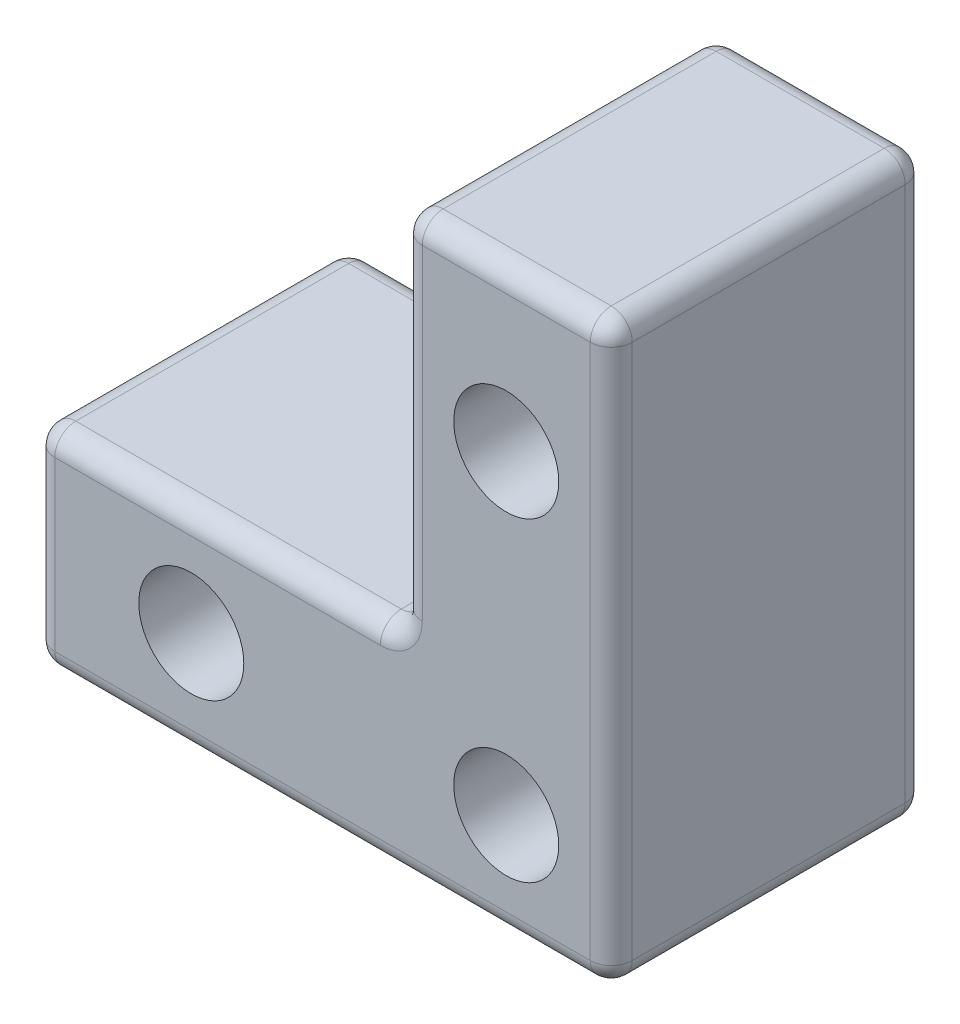
ISO-10303-21;
HEADER;
FILE_DESCRIPTION(('STEP AP214'),'2;1');
FILE_NAME('part.step','',(''),(''),'','','');
FILE_SCHEMA(('AUTOMOTIVE_DESIGN { 1 0 10303 214 1 1 1 1 }'));
ENDSEC;
DATA;
#1=APPLICATION_CONTEXT('core data for automotive mechanical design processes');
#2=APPLICATION_PROTOCOL_DEFINITION('international standard','automotive_design',2000,#1);
#3=PRODUCT_CONTEXT('',#1,'mechanical');
#4=PRODUCT('Part','Part','',(#3));
#5=PRODUCT_RELATED_PRODUCT_CATEGORY('part','',(#4));
#6=PRODUCT_DEFINITION_FORMATION('','',#4);
#7=PRODUCT_DEFINITION_CONTEXT('part definition',#1,'design');
#8=PRODUCT_DEFINITION('design','',#6,#7);
#9=PRODUCT_DEFINITION_SHAPE('','',#8);
#10=(LENGTH_UNIT() NAMED_UNIT(*) SI_UNIT(.MILLI.,.METRE.));
#11=(NAMED_UNIT(*) PLANE_ANGLE_UNIT() SI_UNIT($,.RADIAN.));
#12=(NAMED_UNIT(*) SI_UNIT($,.STERADIAN.) SOLID_ANGLE_UNIT());
#13=UNCERTAINTY_MEASURE_WITH_UNIT(LENGTH_MEASURE(1.E-05),#10,'distance_accuracy_value','');
#14=(GEOMETRIC_REPRESENTATION_CONTEXT(3) GLOBAL_UNCERTAINTY_ASSIGNED_CONTEXT((#13)) GLOBAL_UNIT_ASSIGNED_CONTEXT((#10,
#11,#12)) REPRESENTATION_CONTEXT('',''));
#15=CARTESIAN_POINT('',(0.,0.,0.));
#16=DIRECTION('',(0.,0.,1.));
#17=DIRECTION('',(1.,0.,0.));
#18=AXIS2_PLACEMENT_3D('',#15,#16,#17);
#19=CARTESIAN_POINT('',(0.,0.,30.));
#20=DIRECTION('',(0.,1.,0.));
#21=DIRECTION('',(0.,0.,1.));
#22=AXIS2_PLACEMENT_3D('',#19,#20,#21);
#23=PLANE('',#22);
#24=DIRECTION('',(1.,0.,0.));
#25=VECTOR('',#24,1.);
#26=CARTESIAN_POINT('',(0.,0.,2.));
#27=LINE('',#26,#25);
#28=CARTESIAN_POINT('',(2.,0.,2.));
#29=VERTEX_POINT('',#28);
#30=CARTESIAN_POINT('',(53.,0.,2.));
#31=VERTEX_POINT('',#30);
#32=EDGE_CURVE('E216',#29,#31,#27,.T.);
#33=ORIENTED_EDGE('',*,*,#32,.T.);
#34=DIRECTION('',(0.,0.,1.));
#35=VECTOR('',#34,1.);
#36=CARTESIAN_POINT('',(53.,0.,30.));
#37=LINE('',#36,#35);
#38=CARTESIAN_POINT('',(53.,0.,28.));
#39=VERTEX_POINT('',#38);
#40=EDGE_CURVE('E218',#31,#39,#37,.T.);
#41=ORIENTED_EDGE('',*,*,#40,.T.);
#42=DIRECTION('',(1.,0.,0.));
#43=VECTOR('',#42,1.);
#44=CARTESIAN_POINT('',(0.,0.,28.));
#45=LINE('',#44,#43);
#46=CARTESIAN_POINT('',(2.,0.,28.));
#47=VERTEX_POINT('',#46);
#48=EDGE_CURVE('E212',#39,#47,#45,.F.);
#49=ORIENTED_EDGE('',*,*,#48,.T.);
#50=DIRECTION('',(0.,0.,-1.));
#51=VECTOR('',#50,1.);
#52=CARTESIAN_POINT('',(2.,0.,0.));
#53=LINE('',#52,#51);
#54=EDGE_CURVE('E214',#47,#29,#53,.T.);
#55=ORIENTED_EDGE('',*,*,#54,.T.);
#56=EDGE_LOOP('',(#33,#41,#49,#55));
#57=FACE_BOUND('',#56,.T.);
#58=ADVANCED_FACE('F35',(#57),#23,.F.);
#59=CARTESIAN_POINT('',(0.,55.,30.));
#60=DIRECTION('',(0.,1.,0.));
#61=DIRECTION('',(0.,0.,1.));
#62=AXIS2_PLACEMENT_3D('',#59,#60,#61);
#63=PLANE('',#62);
#64=DIRECTION('',(1.,0.,0.));
#65=VECTOR('',#64,1.);
#66=CARTESIAN_POINT('',(35.,55.,2.));
#67=LINE('',#66,#65);
#68=CARTESIAN_POINT('',(53.,55.,2.));
#69=VERTEX_POINT('',#68);
#70=CARTESIAN_POINT('',(37.,55.,2.));
#71=VERTEX_POINT('',#70);
#72=EDGE_CURVE('E243',#69,#71,#67,.F.);
#73=ORIENTED_EDGE('',*,*,#72,.T.);
#74=DIRECTION('',(0.,0.,1.));
#75=VECTOR('',#74,1.);
#76=CARTESIAN_POINT('',(37.,55.,30.));
#77=LINE('',#76,#75);
#78=CARTESIAN_POINT('',(37.,55.,28.));
#79=VERTEX_POINT('',#78);
#80=EDGE_CURVE('E245',#71,#79,#77,.T.);
#81=ORIENTED_EDGE('',*,*,#80,.T.);
#82=DIRECTION('',(1.,0.,0.));
#83=VECTOR('',#82,1.);
#84=CARTESIAN_POINT('',(0.,55.,28.));
#85=LINE('',#84,#83);
#86=CARTESIAN_POINT('',(53.,55.,28.));
#87=VERTEX_POINT('',#86);
#88=EDGE_CURVE('E239',#79,#87,#85,.T.);
#89=ORIENTED_EDGE('',*,*,#88,.T.);
#90=DIRECTION('',(0.,0.,1.));
#91=VECTOR('',#90,1.);
#92=CARTESIAN_POINT('',(53.,55.,0.));
#93=LINE('',#92,#91);
#94=EDGE_CURVE('E241',#87,#69,#93,.F.);
#95=ORIENTED_EDGE('',*,*,#94,.T.);
#96=EDGE_LOOP('',(#73,#81,#89,#95));
#97=FACE_BOUND('',#96,.T.);
#98=ADVANCED_FACE('F413',(#97),#63,.T.);
#99=CARTESIAN_POINT('',(0.,20.,30.));
#100=DIRECTION('',(0.,1.,0.));
#101=DIRECTION('',(0.,0.,1.));
#102=AXIS2_PLACEMENT_3D('',#99,#100,#101);
#103=PLANE('',#102);
#104=DIRECTION('',(0.,0.,-1.));
#105=VECTOR('',#104,1.);
#106=CARTESIAN_POINT('',(2.,20.,30.));
#107=LINE('',#106,#105);
#108=CARTESIAN_POINT('',(2.,20.,2.));
#109=VERTEX_POINT('',#108);
#110=CARTESIAN_POINT('',(2.,20.,28.));
#111=VERTEX_POINT('',#110);
#112=EDGE_CURVE('E232',#109,#111,#107,.F.);
#113=ORIENTED_EDGE('',*,*,#112,.T.);
#114=DIRECTION('',(1.,0.,0.));
#115=VECTOR('',#114,1.);
#116=CARTESIAN_POINT('',(0.,20.,28.));
#117=LINE('',#116,#115);
#118=CARTESIAN_POINT('',(33.,20.,28.));
#119=VERTEX_POINT('',#118);
#120=EDGE_CURVE('E237',#111,#119,#117,.T.);
#121=ORIENTED_EDGE('',*,*,#120,.T.);
#122=DIRECTION('',(0.,0.,1.));
#123=VECTOR('',#122,1.);
#124=CARTESIAN_POINT('',(33.,20.,30.));
#125=LINE('',#124,#123);
#126=CARTESIAN_POINT('',(33.,20.,2.));
#127=VERTEX_POINT('',#126);
#128=EDGE_CURVE('E234',#119,#127,#125,.F.);
#129=ORIENTED_EDGE('',*,*,#128,.T.);
#130=DIRECTION('',(1.,0.,0.));
#131=VECTOR('',#130,1.);
#132=CARTESIAN_POINT('',(0.,20.,2.));
#133=LINE('',#132,#131);
#134=EDGE_CURVE('E230',#127,#109,#133,.F.);
#135=ORIENTED_EDGE('',*,*,#134,.T.);
#136=EDGE_LOOP('',(#113,#121,#129,#135));
#137=FACE_BOUND('',#136,.T.);
#138=ADVANCED_FACE('F419',(#137),#103,.T.);
#139=CARTESIAN_POINT('',(0.,0.,30.));
#140=DIRECTION('',(-1.,0.,0.));
#141=DIRECTION('',(0.,0.,1.));
#142=AXIS2_PLACEMENT_3D('',#139,#140,#141);
#143=PLANE('',#142);
#144=DIRECTION('',(0.,0.,-1.));
#145=VECTOR('',#144,1.);
#146=CARTESIAN_POINT('',(0.,18.,30.));
#147=LINE('',#146,#145);
#148=CARTESIAN_POINT('',(0.,18.,28.));
#149=VERTEX_POINT('',#148);
#150=CARTESIAN_POINT('',(0.,18.,2.));
#151=VERTEX_POINT('',#150);
#152=EDGE_CURVE('E252',#149,#151,#147,.T.);
#153=ORIENTED_EDGE('',*,*,#152,.T.);
#154=DIRECTION('',(0.,1.,0.));
#155=VECTOR('',#154,1.);
#156=CARTESIAN_POINT('',(0.,0.,2.));
#157=LINE('',#156,#155);
#158=CARTESIAN_POINT('',(0.,2.,2.));
#159=VERTEX_POINT('',#158);
#160=EDGE_CURVE('E255',#151,#159,#157,.F.);
#161=ORIENTED_EDGE('',*,*,#160,.T.);
#162=DIRECTION('',(0.,0.,-1.));
#163=VECTOR('',#162,1.);
#164=CARTESIAN_POINT('',(0.,2.,30.));
#165=LINE('',#164,#163);
#166=CARTESIAN_POINT('',(0.,2.,28.));
#167=VERTEX_POINT('',#166);
#168=EDGE_CURVE('E250',#159,#167,#165,.F.);
#169=ORIENTED_EDGE('',*,*,#168,.T.);
#170=DIRECTION('',(0.,1.,0.));
#171=VECTOR('',#170,1.);
#172=CARTESIAN_POINT('',(0.,0.,28.));
#173=LINE('',#172,#171);
#174=EDGE_CURVE('E248',#167,#149,#173,.T.);
#175=ORIENTED_EDGE('',*,*,#174,.T.);
#176=EDGE_LOOP('',(#153,#161,#169,#175));
#177=FACE_BOUND('',#176,.T.);
#178=ADVANCED_FACE('F397',(#177),#143,.T.);
#179=CARTESIAN_POINT('',(0.,0.,30.));
#180=DIRECTION('',(0.,0.,1.));
#181=DIRECTION('',(1.,0.,0.));
#182=AXIS2_PLACEMENT_3D('',#179,#180,#181);
#183=PLANE('',#182);
#184=DIRECTION('',(1.,0.,0.));
#185=VECTOR('',#184,1.);
#186=CARTESIAN_POINT('',(0.,18.,30.));
#187=LINE('',#186,#185);
#188=CARTESIAN_POINT('',(33.,18.,30.));
#189=VERTEX_POINT('',#188);
#190=CARTESIAN_POINT('',(2.,18.,30.));
#191=VERTEX_POINT('',#190);
#192=EDGE_CURVE('E44',#189,#191,#187,.F.);
#193=ORIENTED_EDGE('',*,*,#192,.T.);
#194=DIRECTION('',(0.,1.,0.));
#195=VECTOR('',#194,1.);
#196=CARTESIAN_POINT('',(2.,0.,30.));
#197=LINE('',#196,#195);
#198=CARTESIAN_POINT('',(2.,2.,30.));
#199=VERTEX_POINT('',#198);
#200=EDGE_CURVE('E11',#191,#199,#197,.F.);
#201=ORIENTED_EDGE('',*,*,#200,.T.);
#202=DIRECTION('',(1.,0.,0.));
#203=VECTOR('',#202,1.);
#204=CARTESIAN_POINT('',(55.,2.,30.));
#205=LINE('',#204,#203);
#206=CARTESIAN_POINT('',(53.,2.,30.));
#207=VERTEX_POINT('',#206);
#208=EDGE_CURVE('E263',#199,#207,#205,.T.);
#209=ORIENTED_EDGE('',*,*,#208,.T.);
#210=DIRECTION('',(0.,-1.,0.));
#211=VECTOR('',#210,1.);
#212=CARTESIAN_POINT('',(53.,55.,30.));
#213=LINE('',#212,#211);
#214=CARTESIAN_POINT('',(53.,53.,30.));
#215=VERTEX_POINT('',#214);
#216=EDGE_CURVE('E257',#207,#215,#213,.F.);
#217=ORIENTED_EDGE('',*,*,#216,.T.);
#218=DIRECTION('',(1.,0.,0.));
#219=VECTOR('',#218,1.);
#220=CARTESIAN_POINT('',(0.,53.,30.));
#221=LINE('',#220,#219);
#222=CARTESIAN_POINT('',(37.,53.,30.));
#223=VERTEX_POINT('',#222);
#224=EDGE_CURVE('E259',#215,#223,#221,.F.);
#225=ORIENTED_EDGE('',*,*,#224,.T.);
#226=DIRECTION('',(0.,1.,0.));
#227=VECTOR('',#226,1.);
#228=CARTESIAN_POINT('',(37.,20.,30.));
#229=LINE('',#228,#227);
#230=CARTESIAN_POINT('',(37.,22.,30.));
#231=VERTEX_POINT('',#230);
#232=EDGE_CURVE('E261',#223,#231,#229,.F.);
#233=ORIENTED_EDGE('',*,*,#232,.T.);
#234=CARTESIAN_POINT('',(33.,22.,30.));
#235=DIRECTION('',(0.,0.,1.));
#236=DIRECTION('',(1.,0.,0.));
#237=AXIS2_PLACEMENT_3D('',#234,#235,#236);
#238=CIRCLE('',#237,4.);
#239=EDGE_CURVE('E55',#189,#231,#238,.T.);
#240=ORIENTED_EDGE('',*,*,#239,.F.);
#241=EDGE_LOOP('',(#193,#201,#209,#217,#225,#233,#240));
#242=FACE_BOUND('',#241,.T.);
#243=CARTESIAN_POINT('',(15.,10.,30.));
#244=DIRECTION('',(0.,0.,1.));
#245=DIRECTION('',(1.,0.,0.));
#246=AXIS2_PLACEMENT_3D('',#243,#244,#245);
#247=CIRCLE('',#246,5.);
#248=CARTESIAN_POINT('',(20.,10.,30.));
#249=VERTEX_POINT('',#248);
#250=EDGE_CURVE('E379',#249,#249,#247,.T.);
#251=ORIENTED_EDGE('',*,*,#250,.F.);
#252=EDGE_LOOP('',(#251));
#253=FACE_BOUND('',#252,.T.);
#254=CARTESIAN_POINT('',(45.,40.,30.));
#255=DIRECTION('',(0.,0.,1.));
#256=DIRECTION('',(1.,0.,0.));
#257=AXIS2_PLACEMENT_3D('',#254,#255,#256);
#258=CIRCLE('',#257,5.);
#259=CARTESIAN_POINT('',(50.,40.,30.));
#260=VERTEX_POINT('',#259);
#261=EDGE_CURVE('E371',#260,#260,#258,.T.);
#262=ORIENTED_EDGE('',*,*,#261,.F.);
#263=EDGE_LOOP('',(#262));
#264=FACE_BOUND('',#263,.T.);
#265=CARTESIAN_POINT('',(45.,10.,30.));
#266=DIRECTION('',(0.,0.,1.));
#267=DIRECTION('',(1.,0.,0.));
#268=AXIS2_PLACEMENT_3D('',#265,#266,#267);
#269=CIRCLE('',#268,5.);
#270=CARTESIAN_POINT('',(50.,10.,30.));
#271=VERTEX_POINT('',#270);
#272=EDGE_CURVE('E361',#271,#271,#269,.T.);
#273=ORIENTED_EDGE('',*,*,#272,.F.);
#274=EDGE_LOOP('',(#273));
#275=FACE_BOUND('',#274,.T.);
#276=ADVANCED_FACE('F394',(#242,#253,#264,#275),#183,.T.);
#277=CARTESIAN_POINT('',(0.,0.,0.));
#278=DIRECTION('',(0.,0.,1.));
#279=DIRECTION('',(1.,0.,0.));
#280=AXIS2_PLACEMENT_3D('',#277,#278,#279);
#281=PLANE('',#280);
#282=DIRECTION('',(0.,1.,0.));
#283=VECTOR('',#282,1.);
#284=CARTESIAN_POINT('',(37.,0.,0.));
#285=LINE('',#284,#283);
#286=CARTESIAN_POINT('',(37.,22.,0.));
#287=VERTEX_POINT('',#286);
#288=CARTESIAN_POINT('',(37.,53.,0.));
#289=VERTEX_POINT('',#288);
#290=EDGE_CURVE('E168',#287,#289,#285,.T.);
#291=ORIENTED_EDGE('',*,*,#290,.T.);
#292=DIRECTION('',(1.,0.,0.));
#293=VECTOR('',#292,1.);
#294=CARTESIAN_POINT('',(55.,53.,0.));
#295=LINE('',#294,#293);
#296=CARTESIAN_POINT('',(53.,53.,0.));
#297=VERTEX_POINT('',#296);
#298=EDGE_CURVE('E201',#289,#297,#295,.T.);
#299=ORIENTED_EDGE('',*,*,#298,.T.);
#300=DIRECTION('',(0.,-1.,0.));
#301=VECTOR('',#300,1.);
#302=CARTESIAN_POINT('',(53.,0.,0.));
#303=LINE('',#302,#301);
#304=CARTESIAN_POINT('',(53.,2.,0.));
#305=VERTEX_POINT('',#304);
#306=EDGE_CURVE('E194',#297,#305,#303,.T.);
#307=ORIENTED_EDGE('',*,*,#306,.T.);
#308=DIRECTION('',(1.,0.,0.));
#309=VECTOR('',#308,1.);
#310=CARTESIAN_POINT('',(0.,2.,0.));
#311=LINE('',#310,#309);
#312=CARTESIAN_POINT('',(2.,2.,0.));
#313=VERTEX_POINT('',#312);
#314=EDGE_CURVE('E191',#305,#313,#311,.F.);
#315=ORIENTED_EDGE('',*,*,#314,.T.);
#316=DIRECTION('',(0.,1.,0.));
#317=VECTOR('',#316,1.);
#318=CARTESIAN_POINT('',(2.,20.,0.));
#319=LINE('',#318,#317);
#320=CARTESIAN_POINT('',(2.,18.,0.));
#321=VERTEX_POINT('',#320);
#322=EDGE_CURVE('E192',#313,#321,#319,.T.);
#323=ORIENTED_EDGE('',*,*,#322,.T.);
#324=DIRECTION('',(1.,0.,0.));
#325=VECTOR('',#324,1.);
#326=CARTESIAN_POINT('',(35.,18.,0.));
#327=LINE('',#326,#325);
#328=CARTESIAN_POINT('',(33.,18.,0.));
#329=VERTEX_POINT('',#328);
#330=EDGE_CURVE('E171',#321,#329,#327,.T.);
#331=ORIENTED_EDGE('',*,*,#330,.T.);
#332=CARTESIAN_POINT('',(33.,22.,0.));
#333=DIRECTION('',(0.,0.,1.));
#334=DIRECTION('',(1.,0.,0.));
#335=AXIS2_PLACEMENT_3D('',#332,#333,#334);
#336=CIRCLE('',#335,4.);
#337=EDGE_CURVE('E163',#287,#329,#336,.F.);
#338=ORIENTED_EDGE('',*,*,#337,.F.);
#339=EDGE_LOOP('',(#291,#299,#307,#315,#323,#331,#338));
#340=FACE_BOUND('',#339,.T.);
#341=CARTESIAN_POINT('',(15.,10.,0.));
#342=DIRECTION('',(0.,0.,1.));
#343=DIRECTION('',(1.,0.,0.));
#344=AXIS2_PLACEMENT_3D('',#341,#342,#343);
#345=CIRCLE('',#344,5.);
#346=CARTESIAN_POINT('',(20.,10.,0.));
#347=VERTEX_POINT('',#346);
#348=EDGE_CURVE('E174',#347,#347,#345,.T.);
#349=ORIENTED_EDGE('',*,*,#348,.T.);
#350=EDGE_LOOP('',(#349));
#351=FACE_BOUND('',#350,.T.);
#352=CARTESIAN_POINT('',(45.,40.,0.));
#353=DIRECTION('',(0.,0.,1.));
#354=DIRECTION('',(1.,0.,0.));
#355=AXIS2_PLACEMENT_3D('',#352,#353,#354);
#356=CIRCLE('',#355,5.);
#357=CARTESIAN_POINT('',(50.,40.,0.));
#358=VERTEX_POINT('',#357);
#359=EDGE_CURVE('E376',#358,#358,#356,.T.);
#360=ORIENTED_EDGE('',*,*,#359,.T.);
#361=EDGE_LOOP('',(#360));
#362=FACE_BOUND('',#361,.T.);
#363=CARTESIAN_POINT('',(45.,10.,0.));
#364=DIRECTION('',(0.,0.,1.));
#365=DIRECTION('',(1.,0.,0.));
#366=AXIS2_PLACEMENT_3D('',#363,#364,#365);
#367=CIRCLE('',#366,5.);
#368=CARTESIAN_POINT('',(50.,10.,0.));
#369=VERTEX_POINT('',#368);
#370=EDGE_CURVE('E366',#369,#369,#367,.T.);
#371=ORIENTED_EDGE('',*,*,#370,.T.);
#372=EDGE_LOOP('',(#371));
#373=FACE_BOUND('',#372,.T.);
#374=ADVANCED_FACE('F165',(#340,#351,#362,#373),#281,.F.);
#375=CARTESIAN_POINT('',(45.,10.,0.));
#376=DIRECTION('',(0.,0.,1.));
#377=DIRECTION('',(1.,0.,0.));
#378=AXIS2_PLACEMENT_3D('',#375,#376,#377);
#379=CYLINDRICAL_SURFACE('',#378,5.);
#380=ORIENTED_EDGE('',*,*,#370,.F.);
#381=EDGE_LOOP('',(#380));
#382=FACE_BOUND('',#381,.T.);
#383=ORIENTED_EDGE('',*,*,#272,.T.);
#384=EDGE_LOOP('',(#383));
#385=FACE_BOUND('',#384,.T.);
#386=ADVANCED_FACE('F403',(#382,#385),#379,.F.);
#387=CARTESIAN_POINT('',(45.,40.,0.));
#388=DIRECTION('',(0.,0.,1.));
#389=DIRECTION('',(1.,0.,0.));
#390=AXIS2_PLACEMENT_3D('',#387,#388,#389);
#391=CYLINDRICAL_SURFACE('',#390,5.);
#392=ORIENTED_EDGE('',*,*,#359,.F.);
#393=EDGE_LOOP('',(#392));
#394=FACE_BOUND('',#393,.T.);
#395=ORIENTED_EDGE('',*,*,#261,.T.);
#396=EDGE_LOOP('',(#395));
#397=FACE_BOUND('',#396,.T.);
#398=ADVANCED_FACE('F390',(#394,#397),#391,.F.);
#399=CARTESIAN_POINT('',(15.,10.,0.));
#400=DIRECTION('',(0.,0.,1.));
#401=DIRECTION('',(1.,0.,0.));
#402=AXIS2_PLACEMENT_3D('',#399,#400,#401);
#403=CYLINDRICAL_SURFACE('',#402,5.);
#404=ORIENTED_EDGE('',*,*,#348,.F.);
#405=EDGE_LOOP('',(#404));
#406=FACE_BOUND('',#405,.T.);
#407=ORIENTED_EDGE('',*,*,#250,.T.);
#408=EDGE_LOOP('',(#407));
#409=FACE_BOUND('',#408,.T.);
#410=ADVANCED_FACE('F386',(#406,#409),#403,.F.);
#411=CARTESIAN_POINT('',(35.,55.,0.));
#412=DIRECTION('',(1.,0.,0.));
#413=DIRECTION('',(0.,0.,-1.));
#414=AXIS2_PLACEMENT_3D('',#411,#412,#413);
#415=PLANE('',#414);
#416=DIRECTION('',(0.,1.,0.));
#417=VECTOR('',#416,1.);
#418=CARTESIAN_POINT('',(35.,55.,2.));
#419=LINE('',#418,#417);
#420=CARTESIAN_POINT('',(35.,53.,2.));
#421=VERTEX_POINT('',#420);
#422=CARTESIAN_POINT('',(35.,22.,2.));
#423=VERTEX_POINT('',#422);
#424=EDGE_CURVE('E225',#421,#423,#419,.F.);
#425=ORIENTED_EDGE('',*,*,#424,.T.);
#426=DIRECTION('',(0.,0.,1.));
#427=VECTOR('',#426,1.);
#428=CARTESIAN_POINT('',(35.,22.,0.));
#429=LINE('',#428,#427);
#430=CARTESIAN_POINT('',(35.,22.,28.));
#431=VERTEX_POINT('',#430);
#432=EDGE_CURVE('E227',#423,#431,#429,.T.);
#433=ORIENTED_EDGE('',*,*,#432,.T.);
#434=DIRECTION('',(0.,1.,0.));
#435=VECTOR('',#434,1.);
#436=CARTESIAN_POINT('',(35.,55.,28.));
#437=LINE('',#436,#435);
#438=CARTESIAN_POINT('',(35.,53.,28.));
#439=VERTEX_POINT('',#438);
#440=EDGE_CURVE('E221',#431,#439,#437,.T.);
#441=ORIENTED_EDGE('',*,*,#440,.T.);
#442=DIRECTION('',(0.,0.,1.));
#443=VECTOR('',#442,1.);
#444=CARTESIAN_POINT('',(35.,53.,0.));
#445=LINE('',#444,#443);
#446=EDGE_CURVE('E223',#439,#421,#445,.F.);
#447=ORIENTED_EDGE('',*,*,#446,.T.);
#448=EDGE_LOOP('',(#425,#433,#441,#447));
#449=FACE_BOUND('',#448,.T.);
#450=ADVANCED_FACE('F389',(#449),#415,.F.);
#451=CARTESIAN_POINT('',(55.,20.,0.));
#452=DIRECTION('',(-1.,0.,0.));
#453=DIRECTION('',(0.,0.,1.));
#454=AXIS2_PLACEMENT_3D('',#451,#452,#453);
#455=PLANE('',#454);
#456=DIRECTION('',(0.,0.,1.));
#457=VECTOR('',#456,1.);
#458=CARTESIAN_POINT('',(55.,2.,0.));
#459=LINE('',#458,#457);
#460=CARTESIAN_POINT('',(55.,2.,28.));
#461=VERTEX_POINT('',#460);
#462=CARTESIAN_POINT('',(55.,2.,2.));
#463=VERTEX_POINT('',#462);
#464=EDGE_CURVE('E207',#461,#463,#459,.F.);
#465=ORIENTED_EDGE('',*,*,#464,.T.);
#466=DIRECTION('',(0.,-1.,0.));
#467=VECTOR('',#466,1.);
#468=CARTESIAN_POINT('',(55.,20.,2.));
#469=LINE('',#468,#467);
#470=CARTESIAN_POINT('',(55.,53.,2.));
#471=VERTEX_POINT('',#470);
#472=EDGE_CURVE('E209',#463,#471,#469,.F.);
#473=ORIENTED_EDGE('',*,*,#472,.T.);
#474=DIRECTION('',(0.,0.,1.));
#475=VECTOR('',#474,1.);
#476=CARTESIAN_POINT('',(55.,53.,30.));
#477=LINE('',#476,#475);
#478=CARTESIAN_POINT('',(55.,53.,28.));
#479=VERTEX_POINT('',#478);
#480=EDGE_CURVE('E205',#471,#479,#477,.T.);
#481=ORIENTED_EDGE('',*,*,#480,.T.);
#482=DIRECTION('',(0.,-1.,0.));
#483=VECTOR('',#482,1.);
#484=CARTESIAN_POINT('',(55.,0.,28.));
#485=LINE('',#484,#483);
#486=EDGE_CURVE('E203',#479,#461,#485,.T.);
#487=ORIENTED_EDGE('',*,*,#486,.T.);
#488=EDGE_LOOP('',(#465,#473,#481,#487));
#489=FACE_BOUND('',#488,.T.);
#490=ADVANCED_FACE('F535',(#489),#455,.F.);
#491=CARTESIAN_POINT('',(0.,18.,28.));
#492=DIRECTION('',(1.,0.,0.));
#493=DIRECTION('',(0.,0.,-1.));
#494=AXIS2_PLACEMENT_3D('',#491,#492,#493);
#495=CYLINDRICAL_SURFACE('',#494,2.);
#496=CARTESIAN_POINT('',(2.,18.,28.));
#497=DIRECTION('',(-1.,0.,0.));
#498=DIRECTION('',(0.,0.,1.));
#499=AXIS2_PLACEMENT_3D('',#496,#497,#498);
#500=CIRCLE('',#499,2.);
#501=EDGE_CURVE('E355',#191,#111,#500,.T.);
#502=ORIENTED_EDGE('',*,*,#501,.F.);
#503=ORIENTED_EDGE('',*,*,#192,.F.);
#504=CARTESIAN_POINT('',(33.,18.,28.));
#505=DIRECTION('',(1.,0.,0.));
#506=DIRECTION('',(0.,0.,-1.));
#507=AXIS2_PLACEMENT_3D('',#504,#505,#506);
#508=CIRCLE('',#507,2.);
#509=EDGE_CURVE('E39',#119,#189,#508,.T.);
#510=ORIENTED_EDGE('',*,*,#509,.F.);
#511=ORIENTED_EDGE('',*,*,#120,.F.);
#512=EDGE_LOOP('',(#502,#503,#510,#511));
#513=FACE_BOUND('',#512,.T.);
#514=ADVANCED_FACE('F37',(#513),#495,.T.);
#515=CARTESIAN_POINT('',(33.,22.,28.));
#516=DIRECTION('',(0.,0.,1.));
#517=DIRECTION('',(1.,0.,0.));
#518=AXIS2_PLACEMENT_3D('',#515,#516,#517);
#519=TOROIDAL_SURFACE('',#518,4.,2.);
#520=ORIENTED_EDGE('',*,*,#509,.T.);
#521=ORIENTED_EDGE('',*,*,#239,.T.);
#522=CARTESIAN_POINT('',(37.,22.,28.));
#523=DIRECTION('',(0.,-1.,0.));
#524=DIRECTION('',(0.,0.,-1.));
#525=AXIS2_PLACEMENT_3D('',#522,#523,#524);
#526=CIRCLE('',#525,2.);
#527=EDGE_CURVE('E353',#431,#231,#526,.F.);
#528=ORIENTED_EDGE('',*,*,#527,.F.);
#529=CARTESIAN_POINT('',(33.,22.,28.));
#530=DIRECTION('',(0.,0.,1.));
#531=DIRECTION('',(1.,0.,0.));
#532=AXIS2_PLACEMENT_3D('',#529,#530,#531);
#533=CIRCLE('',#532,2.);
#534=EDGE_CURVE('E350',#119,#431,#533,.T.);
#535=ORIENTED_EDGE('',*,*,#534,.F.);
#536=EDGE_LOOP('',(#520,#521,#528,#535));
#537=FACE_BOUND('',#536,.T.);
#538=ADVANCED_FACE('F530',(#537),#519,.T.);
#539=CARTESIAN_POINT('',(2.,18.,28.));
#540=DIRECTION('',(0.,1.,0.));
#541=DIRECTION('',(0.,0.,1.));
#542=AXIS2_PLACEMENT_3D('',#539,#540,#541);
#543=SPHERICAL_SURFACE('',#542,2.);
#544=CARTESIAN_POINT('',(2.,18.,28.));
#545=DIRECTION('',(0.,1.,0.));
#546=DIRECTION('',(0.,0.,1.));
#547=AXIS2_PLACEMENT_3D('',#544,#545,#546);
#548=CIRCLE('',#547,2.);
#549=EDGE_CURVE('E344',#191,#149,#548,.F.);
#550=ORIENTED_EDGE('',*,*,#549,.F.);
#551=ORIENTED_EDGE('',*,*,#501,.T.);
#552=CARTESIAN_POINT('',(2.,18.,28.));
#553=DIRECTION('',(0.,0.,1.));
#554=DIRECTION('',(1.,0.,0.));
#555=AXIS2_PLACEMENT_3D('',#552,#553,#554);
#556=CIRCLE('',#555,2.);
#557=EDGE_CURVE('E347',#149,#111,#556,.F.);
#558=ORIENTED_EDGE('',*,*,#557,.F.);
#559=EDGE_LOOP('',(#550,#551,#558));
#560=FACE_BOUND('',#559,.T.);
#561=ADVANCED_FACE('F527',(#560),#543,.T.);
#562=CARTESIAN_POINT('',(37.,55.,28.));
#563=DIRECTION('',(0.,-1.,0.));
#564=DIRECTION('',(0.,0.,-1.));
#565=AXIS2_PLACEMENT_3D('',#562,#563,#564);
#566=CYLINDRICAL_SURFACE('',#565,2.);
#567=ORIENTED_EDGE('',*,*,#527,.T.);
#568=ORIENTED_EDGE('',*,*,#232,.F.);
#569=CARTESIAN_POINT('',(37.,53.,28.));
#570=DIRECTION('',(0.,1.,0.));
#571=DIRECTION('',(0.,0.,1.));
#572=AXIS2_PLACEMENT_3D('',#569,#570,#571);
#573=CIRCLE('',#572,2.);
#574=EDGE_CURVE('E341',#439,#223,#573,.T.);
#575=ORIENTED_EDGE('',*,*,#574,.F.);
#576=ORIENTED_EDGE('',*,*,#440,.F.);
#577=EDGE_LOOP('',(#567,#568,#575,#576));
#578=FACE_BOUND('',#577,.T.);
#579=ADVANCED_FACE('F523',(#578),#566,.T.);
#580=CARTESIAN_POINT('',(33.,22.,0.));
#581=DIRECTION('',(0.,0.,1.));
#582=DIRECTION('',(1.,0.,0.));
#583=AXIS2_PLACEMENT_3D('',#580,#581,#582);
#584=CYLINDRICAL_SURFACE('',#583,2.);
#585=ORIENTED_EDGE('',*,*,#534,.T.);
#586=ORIENTED_EDGE('',*,*,#432,.F.);
#587=CARTESIAN_POINT('',(33.,22.,2.));
#588=DIRECTION('',(0.,0.,1.));
#589=DIRECTION('',(1.,0.,0.));
#590=AXIS2_PLACEMENT_3D('',#587,#588,#589);
#591=CIRCLE('',#590,2.);
#592=EDGE_CURVE('E181',#127,#423,#591,.T.);
#593=ORIENTED_EDGE('',*,*,#592,.F.);
#594=ORIENTED_EDGE('',*,*,#128,.F.);
#595=EDGE_LOOP('',(#585,#586,#593,#594));
#596=FACE_BOUND('',#595,.T.);
#597=ADVANCED_FACE('F519',(#596),#584,.F.);
#598=CARTESIAN_POINT('',(0.,18.,2.));
#599=DIRECTION('',(-1.,0.,0.));
#600=DIRECTION('',(0.,0.,1.));
#601=AXIS2_PLACEMENT_3D('',#598,#599,#600);
#602=CYLINDRICAL_SURFACE('',#601,2.);
#603=CARTESIAN_POINT('',(2.,18.,2.));
#604=DIRECTION('',(-1.,0.,0.));
#605=DIRECTION('',(0.,0.,1.));
#606=AXIS2_PLACEMENT_3D('',#603,#604,#605);
#607=CIRCLE('',#606,2.);
#608=EDGE_CURVE('E335',#109,#321,#607,.T.);
#609=ORIENTED_EDGE('',*,*,#608,.F.);
#610=ORIENTED_EDGE('',*,*,#134,.F.);
#611=CARTESIAN_POINT('',(33.,18.,2.));
#612=DIRECTION('',(1.,0.,0.));
#613=DIRECTION('',(0.,0.,-1.));
#614=AXIS2_PLACEMENT_3D('',#611,#612,#613);
#615=CIRCLE('',#614,2.);
#616=EDGE_CURVE('E338',#329,#127,#615,.T.);
#617=ORIENTED_EDGE('',*,*,#616,.F.);
#618=ORIENTED_EDGE('',*,*,#330,.F.);
#619=EDGE_LOOP('',(#609,#610,#617,#618));
#620=FACE_BOUND('',#619,.T.);
#621=ADVANCED_FACE('F515',(#620),#602,.T.);
#622=CARTESIAN_POINT('',(2.,18.,30.));
#623=DIRECTION('',(0.,0.,-1.));
#624=DIRECTION('',(-1.,0.,0.));
#625=AXIS2_PLACEMENT_3D('',#622,#623,#624);
#626=CYLINDRICAL_SURFACE('',#625,2.);
#627=ORIENTED_EDGE('',*,*,#557,.T.);
#628=ORIENTED_EDGE('',*,*,#112,.F.);
#629=CARTESIAN_POINT('',(2.,18.,2.));
#630=DIRECTION('',(0.,0.,-1.));
#631=DIRECTION('',(-1.,0.,0.));
#632=AXIS2_PLACEMENT_3D('',#629,#630,#631);
#633=CIRCLE('',#632,2.);
#634=EDGE_CURVE('E332',#151,#109,#633,.T.);
#635=ORIENTED_EDGE('',*,*,#634,.F.);
#636=ORIENTED_EDGE('',*,*,#152,.F.);
#637=EDGE_LOOP('',(#627,#628,#635,#636));
#638=FACE_BOUND('',#637,.T.);
#639=ADVANCED_FACE('F511',(#638),#626,.T.);
#640=CARTESIAN_POINT('',(2.,0.,28.));
#641=DIRECTION('',(0.,1.,0.));
#642=DIRECTION('',(0.,0.,1.));
#643=AXIS2_PLACEMENT_3D('',#640,#641,#642);
#644=CYLINDRICAL_SURFACE('',#643,2.);
#645=ORIENTED_EDGE('',*,*,#549,.T.);
#646=ORIENTED_EDGE('',*,*,#174,.F.);
#647=CARTESIAN_POINT('',(2.,2.,28.));
#648=DIRECTION('',(0.,-1.,0.));
#649=DIRECTION('',(0.,0.,-1.));
#650=AXIS2_PLACEMENT_3D('',#647,#648,#649);
#651=CIRCLE('',#650,2.);
#652=EDGE_CURVE('E329',#199,#167,#651,.T.);
#653=ORIENTED_EDGE('',*,*,#652,.F.);
#654=ORIENTED_EDGE('',*,*,#200,.F.);
#655=EDGE_LOOP('',(#645,#646,#653,#654));
#656=FACE_BOUND('',#655,.T.);
#657=ADVANCED_FACE('F507',(#656),#644,.T.);
#658=CARTESIAN_POINT('',(37.,53.,28.));
#659=DIRECTION('',(0.,0.,1.));
#660=DIRECTION('',(1.,0.,0.));
#661=AXIS2_PLACEMENT_3D('',#658,#659,#660);
#662=SPHERICAL_SURFACE('',#661,2.);
#663=CARTESIAN_POINT('',(37.,53.,28.));
#664=DIRECTION('',(0.,0.,1.));
#665=DIRECTION('',(1.,0.,0.));
#666=AXIS2_PLACEMENT_3D('',#663,#664,#665);
#667=CIRCLE('',#666,2.);
#668=EDGE_CURVE('E184',#439,#79,#667,.F.);
#669=ORIENTED_EDGE('',*,*,#668,.F.);
#670=ORIENTED_EDGE('',*,*,#574,.T.);
#671=CARTESIAN_POINT('',(37.,53.,28.));
#672=DIRECTION('',(-1.,0.,0.));
#673=DIRECTION('',(0.,0.,1.));
#674=AXIS2_PLACEMENT_3D('',#671,#672,#673);
#675=CIRCLE('',#674,2.);
#676=EDGE_CURVE('E326',#79,#223,#675,.F.);
#677=ORIENTED_EDGE('',*,*,#676,.F.);
#678=EDGE_LOOP('',(#669,#670,#677));
#679=FACE_BOUND('',#678,.T.);
#680=ADVANCED_FACE('F504',(#679),#662,.T.);
#681=CARTESIAN_POINT('',(33.,22.,2.));
#682=DIRECTION('',(0.,0.,1.));
#683=DIRECTION('',(1.,0.,0.));
#684=AXIS2_PLACEMENT_3D('',#681,#682,#683);
#685=TOROIDAL_SURFACE('',#684,4.,2.);
#686=ORIENTED_EDGE('',*,*,#616,.T.);
#687=ORIENTED_EDGE('',*,*,#592,.T.);
#688=CARTESIAN_POINT('',(37.,22.,2.));
#689=DIRECTION('',(0.,-1.,0.));
#690=DIRECTION('',(0.,0.,-1.));
#691=AXIS2_PLACEMENT_3D('',#688,#689,#690);
#692=CIRCLE('',#691,2.);
#693=EDGE_CURVE('E178',#287,#423,#692,.F.);
#694=ORIENTED_EDGE('',*,*,#693,.F.);
#695=ORIENTED_EDGE('',*,*,#337,.T.);
#696=EDGE_LOOP('',(#686,#687,#694,#695));
#697=FACE_BOUND('',#696,.T.);
#698=ADVANCED_FACE('F179',(#697),#685,.T.);
#699=CARTESIAN_POINT('',(2.,18.,2.));
#700=DIRECTION('',(0.,1.,0.));
#701=DIRECTION('',(0.,0.,1.));
#702=AXIS2_PLACEMENT_3D('',#699,#700,#701);
#703=SPHERICAL_SURFACE('',#702,2.);
#704=ORIENTED_EDGE('',*,*,#634,.T.);
#705=ORIENTED_EDGE('',*,*,#608,.T.);
#706=CARTESIAN_POINT('',(2.,18.,2.));
#707=DIRECTION('',(0.,1.,0.));
#708=DIRECTION('',(0.,0.,1.));
#709=AXIS2_PLACEMENT_3D('',#706,#707,#708);
#710=CIRCLE('',#709,2.);
#711=EDGE_CURVE('E185',#151,#321,#710,.F.);
#712=ORIENTED_EDGE('',*,*,#711,.F.);
#713=EDGE_LOOP('',(#704,#705,#712));
#714=FACE_BOUND('',#713,.T.);
#715=ADVANCED_FACE('F497',(#714),#703,.T.);
#716=CARTESIAN_POINT('',(2.,2.,28.));
#717=DIRECTION('',(-1.,0.,0.));
#718=DIRECTION('',(0.,0.,1.));
#719=AXIS2_PLACEMENT_3D('',#716,#717,#718);
#720=SPHERICAL_SURFACE('',#719,2.);
#721=CARTESIAN_POINT('',(2.,2.,28.));
#722=DIRECTION('',(-1.,0.,0.));
#723=DIRECTION('',(0.,0.,1.));
#724=AXIS2_PLACEMENT_3D('',#721,#722,#723);
#725=CIRCLE('',#724,2.);
#726=EDGE_CURVE('E316',#199,#47,#725,.F.);
#727=ORIENTED_EDGE('',*,*,#726,.F.);
#728=ORIENTED_EDGE('',*,*,#652,.T.);
#729=CARTESIAN_POINT('',(2.,2.,28.));
#730=DIRECTION('',(0.,0.,1.));
#731=DIRECTION('',(1.,0.,0.));
#732=AXIS2_PLACEMENT_3D('',#729,#730,#731);
#733=CIRCLE('',#732,2.);
#734=EDGE_CURVE('E319',#47,#167,#733,.F.);
#735=ORIENTED_EDGE('',*,*,#734,.F.);
#736=EDGE_LOOP('',(#727,#728,#735));
#737=FACE_BOUND('',#736,.T.);
#738=ADVANCED_FACE('F493',(#737),#720,.T.);
#739=CARTESIAN_POINT('',(0.,53.,28.));
#740=DIRECTION('',(1.,0.,0.));
#741=DIRECTION('',(0.,0.,-1.));
#742=AXIS2_PLACEMENT_3D('',#739,#740,#741);
#743=CYLINDRICAL_SURFACE('',#742,2.);
#744=ORIENTED_EDGE('',*,*,#676,.T.);
#745=ORIENTED_EDGE('',*,*,#224,.F.);
#746=CARTESIAN_POINT('',(53.,53.,28.));
#747=DIRECTION('',(1.,0.,0.));
#748=DIRECTION('',(0.,0.,-1.));
#749=AXIS2_PLACEMENT_3D('',#746,#747,#748);
#750=CIRCLE('',#749,2.);
#751=EDGE_CURVE('E310',#87,#215,#750,.T.);
#752=ORIENTED_EDGE('',*,*,#751,.F.);
#753=ORIENTED_EDGE('',*,*,#88,.F.);
#754=EDGE_LOOP('',(#744,#745,#752,#753));
#755=FACE_BOUND('',#754,.T.);
#756=ADVANCED_FACE('F489',(#755),#743,.T.);
#757=CARTESIAN_POINT('',(37.,53.,30.));
#758=DIRECTION('',(0.,0.,-1.));
#759=DIRECTION('',(-1.,0.,0.));
#760=AXIS2_PLACEMENT_3D('',#757,#758,#759);
#761=CYLINDRICAL_SURFACE('',#760,2.);
#762=ORIENTED_EDGE('',*,*,#668,.T.);
#763=ORIENTED_EDGE('',*,*,#80,.F.);
#764=CARTESIAN_POINT('',(37.,53.,2.));
#765=DIRECTION('',(0.,0.,-1.));
#766=DIRECTION('',(-1.,0.,0.));
#767=AXIS2_PLACEMENT_3D('',#764,#765,#766);
#768=CIRCLE('',#767,2.);
#769=EDGE_CURVE('E307',#421,#71,#768,.T.);
#770=ORIENTED_EDGE('',*,*,#769,.F.);
#771=ORIENTED_EDGE('',*,*,#446,.F.);
#772=EDGE_LOOP('',(#762,#763,#770,#771));
#773=FACE_BOUND('',#772,.T.);
#774=ADVANCED_FACE('F486',(#773),#761,.T.);
#775=CARTESIAN_POINT('',(37.,0.,2.));
#776=DIRECTION('',(0.,1.,0.));
#777=DIRECTION('',(0.,0.,1.));
#778=AXIS2_PLACEMENT_3D('',#775,#776,#777);
#779=CYLINDRICAL_SURFACE('',#778,2.);
#780=ORIENTED_EDGE('',*,*,#693,.T.);
#781=ORIENTED_EDGE('',*,*,#424,.F.);
#782=CARTESIAN_POINT('',(37.,53.,2.));
#783=DIRECTION('',(0.,1.,0.));
#784=DIRECTION('',(0.,0.,1.));
#785=AXIS2_PLACEMENT_3D('',#782,#783,#784);
#786=CIRCLE('',#785,2.);
#787=EDGE_CURVE('E189',#289,#421,#786,.T.);
#788=ORIENTED_EDGE('',*,*,#787,.F.);
#789=ORIENTED_EDGE('',*,*,#290,.F.);
#790=EDGE_LOOP('',(#780,#781,#788,#789));
#791=FACE_BOUND('',#790,.T.);
#792=ADVANCED_FACE('F187',(#791),#779,.T.);
#793=CARTESIAN_POINT('',(2.,0.,2.));
#794=DIRECTION('',(0.,-1.,0.));
#795=DIRECTION('',(0.,0.,-1.));
#796=AXIS2_PLACEMENT_3D('',#793,#794,#795);
#797=CYLINDRICAL_SURFACE('',#796,2.);
#798=ORIENTED_EDGE('',*,*,#711,.T.);
#799=ORIENTED_EDGE('',*,*,#322,.F.);
#800=CARTESIAN_POINT('',(2.,2.,2.));
#801=DIRECTION('',(0.,-1.,0.));
#802=DIRECTION('',(0.,0.,-1.));
#803=AXIS2_PLACEMENT_3D('',#800,#801,#802);
#804=CIRCLE('',#803,2.);
#805=EDGE_CURVE('E303',#159,#313,#804,.T.);
#806=ORIENTED_EDGE('',*,*,#805,.F.);
#807=ORIENTED_EDGE('',*,*,#160,.F.);
#808=EDGE_LOOP('',(#798,#799,#806,#807));
#809=FACE_BOUND('',#808,.T.);
#810=ADVANCED_FACE('F479',(#809),#797,.T.);
#811=CARTESIAN_POINT('',(2.,2.,30.));
#812=DIRECTION('',(0.,0.,1.));
#813=DIRECTION('',(1.,0.,0.));
#814=AXIS2_PLACEMENT_3D('',#811,#812,#813);
#815=CYLINDRICAL_SURFACE('',#814,2.);
#816=ORIENTED_EDGE('',*,*,#734,.T.);
#817=ORIENTED_EDGE('',*,*,#168,.F.);
#818=CARTESIAN_POINT('',(2.,2.,2.));
#819=DIRECTION('',(0.,0.,-1.));
#820=DIRECTION('',(-1.,0.,0.));
#821=AXIS2_PLACEMENT_3D('',#818,#819,#820);
#822=CIRCLE('',#821,2.);
#823=EDGE_CURVE('E300',#29,#159,#822,.T.);
#824=ORIENTED_EDGE('',*,*,#823,.F.);
#825=ORIENTED_EDGE('',*,*,#54,.F.);
#826=EDGE_LOOP('',(#816,#817,#824,#825));
#827=FACE_BOUND('',#826,.T.);
#828=ADVANCED_FACE('F475',(#827),#815,.T.);
#829=CARTESIAN_POINT('',(0.,2.,28.));
#830=DIRECTION('',(-1.,0.,0.));
#831=DIRECTION('',(0.,0.,1.));
#832=AXIS2_PLACEMENT_3D('',#829,#830,#831);
#833=CYLINDRICAL_SURFACE('',#832,2.);
#834=ORIENTED_EDGE('',*,*,#726,.T.);
#835=ORIENTED_EDGE('',*,*,#48,.F.);
#836=CARTESIAN_POINT('',(53.,2.,28.));
#837=DIRECTION('',(1.,0.,0.));
#838=DIRECTION('',(0.,0.,-1.));
#839=AXIS2_PLACEMENT_3D('',#836,#837,#838);
#840=CIRCLE('',#839,2.);
#841=EDGE_CURVE('E297',#207,#39,#840,.T.);
#842=ORIENTED_EDGE('',*,*,#841,.F.);
#843=ORIENTED_EDGE('',*,*,#208,.F.);
#844=EDGE_LOOP('',(#834,#835,#842,#843));
#845=FACE_BOUND('',#844,.T.);
#846=ADVANCED_FACE('F471',(#845),#833,.T.);
#847=CARTESIAN_POINT('',(53.,20.,28.));
#848=DIRECTION('',(0.,1.,0.));
#849=DIRECTION('',(0.,0.,1.));
#850=AXIS2_PLACEMENT_3D('',#847,#848,#849);
#851=CYLINDRICAL_SURFACE('',#850,2.);
#852=CARTESIAN_POINT('',(53.,53.,28.));
#853=DIRECTION('',(0.,1.,0.));
#854=DIRECTION('',(0.,0.,1.));
#855=AXIS2_PLACEMENT_3D('',#852,#853,#854);
#856=CIRCLE('',#855,2.);
#857=EDGE_CURVE('E313',#215,#479,#856,.T.);
#858=ORIENTED_EDGE('',*,*,#857,.F.);
#859=ORIENTED_EDGE('',*,*,#216,.F.);
#860=CARTESIAN_POINT('',(53.,2.,28.));
#861=DIRECTION('',(0.,-1.,0.));
#862=DIRECTION('',(0.,0.,-1.));
#863=AXIS2_PLACEMENT_3D('',#860,#861,#862);
#864=CIRCLE('',#863,2.);
#865=EDGE_CURVE('E295',#461,#207,#864,.T.);
#866=ORIENTED_EDGE('',*,*,#865,.F.);
#867=ORIENTED_EDGE('',*,*,#486,.F.);
#868=EDGE_LOOP('',(#858,#859,#866,#867));
#869=FACE_BOUND('',#868,.T.);
#870=ADVANCED_FACE('F467',(#869),#851,.T.);
#871=CARTESIAN_POINT('',(53.,53.,28.));
#872=DIRECTION('',(0.,0.,1.));
#873=DIRECTION('',(1.,0.,0.));
#874=AXIS2_PLACEMENT_3D('',#871,#872,#873);
#875=SPHERICAL_SURFACE('',#874,2.);
#876=ORIENTED_EDGE('',*,*,#751,.T.);
#877=ORIENTED_EDGE('',*,*,#857,.T.);
#878=CARTESIAN_POINT('',(53.,53.,28.));
#879=DIRECTION('',(0.,0.,1.));
#880=DIRECTION('',(1.,0.,0.));
#881=AXIS2_PLACEMENT_3D('',#878,#879,#880);
#882=CIRCLE('',#881,2.);
#883=EDGE_CURVE('E292',#87,#479,#882,.F.);
#884=ORIENTED_EDGE('',*,*,#883,.F.);
#885=EDGE_LOOP('',(#876,#877,#884));
#886=FACE_BOUND('',#885,.T.);
#887=ADVANCED_FACE('F463',(#886),#875,.T.);
#888=CARTESIAN_POINT('',(37.,53.,2.));
#889=DIRECTION('',(-1.,0.,0.));
#890=DIRECTION('',(0.,0.,1.));
#891=AXIS2_PLACEMENT_3D('',#888,#889,#890);
#892=SPHERICAL_SURFACE('',#891,2.);
#893=ORIENTED_EDGE('',*,*,#787,.T.);
#894=ORIENTED_EDGE('',*,*,#769,.T.);
#895=CARTESIAN_POINT('',(37.,53.,2.));
#896=DIRECTION('',(-1.,0.,0.));
#897=DIRECTION('',(0.,0.,1.));
#898=AXIS2_PLACEMENT_3D('',#895,#896,#897);
#899=CIRCLE('',#898,2.);
#900=EDGE_CURVE('E289',#289,#71,#899,.F.);
#901=ORIENTED_EDGE('',*,*,#900,.F.);
#902=EDGE_LOOP('',(#893,#894,#901));
#903=FACE_BOUND('',#902,.T.);
#904=ADVANCED_FACE('F459',(#903),#892,.T.);
#905=CARTESIAN_POINT('',(2.,2.,2.));
#906=DIRECTION('',(-1.,0.,0.));
#907=DIRECTION('',(0.,0.,1.));
#908=AXIS2_PLACEMENT_3D('',#905,#906,#907);
#909=SPHERICAL_SURFACE('',#908,2.);
#910=ORIENTED_EDGE('',*,*,#823,.T.);
#911=ORIENTED_EDGE('',*,*,#805,.T.);
#912=CARTESIAN_POINT('',(2.,2.,2.));
#913=DIRECTION('',(-1.,0.,0.));
#914=DIRECTION('',(0.,0.,1.));
#915=AXIS2_PLACEMENT_3D('',#912,#913,#914);
#916=CIRCLE('',#915,2.);
#917=EDGE_CURVE('E286',#29,#313,#916,.F.);
#918=ORIENTED_EDGE('',*,*,#917,.F.);
#919=EDGE_LOOP('',(#910,#911,#918));
#920=FACE_BOUND('',#919,.T.);
#921=ADVANCED_FACE('F455',(#920),#909,.T.);
#922=CARTESIAN_POINT('',(53.,2.,28.));
#923=DIRECTION('',(0.,0.,1.));
#924=DIRECTION('',(1.,0.,0.));
#925=AXIS2_PLACEMENT_3D('',#922,#923,#924);
#926=SPHERICAL_SURFACE('',#925,2.);
#927=ORIENTED_EDGE('',*,*,#865,.T.);
#928=ORIENTED_EDGE('',*,*,#841,.T.);
#929=CARTESIAN_POINT('',(53.,2.,28.));
#930=DIRECTION('',(0.,0.,1.));
#931=DIRECTION('',(1.,0.,0.));
#932=AXIS2_PLACEMENT_3D('',#929,#930,#931);
#933=CIRCLE('',#932,2.);
#934=EDGE_CURVE('E284',#461,#39,#933,.F.);
#935=ORIENTED_EDGE('',*,*,#934,.F.);
#936=EDGE_LOOP('',(#927,#928,#935));
#937=FACE_BOUND('',#936,.T.);
#938=ADVANCED_FACE('F451',(#937),#926,.T.);
#939=CARTESIAN_POINT('',(53.,53.,0.));
#940=DIRECTION('',(0.,0.,-1.));
#941=DIRECTION('',(-1.,0.,0.));
#942=AXIS2_PLACEMENT_3D('',#939,#940,#941);
#943=CYLINDRICAL_SURFACE('',#942,2.);
#944=ORIENTED_EDGE('',*,*,#883,.T.);
#945=ORIENTED_EDGE('',*,*,#480,.F.);
#946=CARTESIAN_POINT('',(53.,53.,2.));
#947=DIRECTION('',(0.,0.,-1.));
#948=DIRECTION('',(-1.,0.,0.));
#949=AXIS2_PLACEMENT_3D('',#946,#947,#948);
#950=CIRCLE('',#949,2.);
#951=EDGE_CURVE('E281',#69,#471,#950,.T.);
#952=ORIENTED_EDGE('',*,*,#951,.F.);
#953=ORIENTED_EDGE('',*,*,#94,.F.);
#954=EDGE_LOOP('',(#944,#945,#952,#953));
#955=FACE_BOUND('',#954,.T.);
#956=ADVANCED_FACE('F447',(#955),#943,.T.);
#957=CARTESIAN_POINT('',(0.,53.,2.));
#958=DIRECTION('',(-1.,0.,0.));
#959=DIRECTION('',(0.,0.,1.));
#960=AXIS2_PLACEMENT_3D('',#957,#958,#959);
#961=CYLINDRICAL_SURFACE('',#960,2.);
#962=ORIENTED_EDGE('',*,*,#900,.T.);
#963=ORIENTED_EDGE('',*,*,#72,.F.);
#964=CARTESIAN_POINT('',(53.,53.,2.));
#965=DIRECTION('',(1.,0.,0.));
#966=DIRECTION('',(0.,0.,-1.));
#967=AXIS2_PLACEMENT_3D('',#964,#965,#966);
#968=CIRCLE('',#967,2.);
#969=EDGE_CURVE('E278',#297,#69,#968,.T.);
#970=ORIENTED_EDGE('',*,*,#969,.F.);
#971=ORIENTED_EDGE('',*,*,#298,.F.);
#972=EDGE_LOOP('',(#962,#963,#970,#971));
#973=FACE_BOUND('',#972,.T.);
#974=ADVANCED_FACE('F443',(#973),#961,.T.);
#975=CARTESIAN_POINT('',(0.,2.,2.));
#976=DIRECTION('',(1.,0.,0.));
#977=DIRECTION('',(0.,0.,-1.));
#978=AXIS2_PLACEMENT_3D('',#975,#976,#977);
#979=CYLINDRICAL_SURFACE('',#978,2.);
#980=ORIENTED_EDGE('',*,*,#917,.T.);
#981=ORIENTED_EDGE('',*,*,#314,.F.);
#982=CARTESIAN_POINT('',(53.,2.,2.));
#983=DIRECTION('',(1.,0.,0.));
#984=DIRECTION('',(0.,0.,-1.));
#985=AXIS2_PLACEMENT_3D('',#982,#983,#984);
#986=CIRCLE('',#985,2.);
#987=EDGE_CURVE('E275',#31,#305,#986,.T.);
#988=ORIENTED_EDGE('',*,*,#987,.F.);
#989=ORIENTED_EDGE('',*,*,#32,.F.);
#990=EDGE_LOOP('',(#980,#981,#988,#989));
#991=FACE_BOUND('',#990,.T.);
#992=ADVANCED_FACE('F439',(#991),#979,.T.);
#993=CARTESIAN_POINT('',(53.,2.,30.));
#994=DIRECTION('',(0.,0.,1.));
#995=DIRECTION('',(1.,0.,0.));
#996=AXIS2_PLACEMENT_3D('',#993,#994,#995);
#997=CYLINDRICAL_SURFACE('',#996,2.);
#998=ORIENTED_EDGE('',*,*,#934,.T.);
#999=ORIENTED_EDGE('',*,*,#40,.F.);
#1000=CARTESIAN_POINT('',(53.,2.,2.));
#1001=DIRECTION('',(0.,0.,-1.));
#1002=DIRECTION('',(0.,1.,0.));
#1003=AXIS2_PLACEMENT_3D('',#1000,#1001,#1002);
#1004=CIRCLE('',#1003,2.);
#1005=EDGE_CURVE('E272',#463,#31,#1004,.T.);
#1006=ORIENTED_EDGE('',*,*,#1005,.F.);
#1007=ORIENTED_EDGE('',*,*,#464,.F.);
#1008=EDGE_LOOP('',(#998,#999,#1006,#1007));
#1009=FACE_BOUND('',#1008,.T.);
#1010=ADVANCED_FACE('F435',(#1009),#997,.T.);
#1011=CARTESIAN_POINT('',(53.,53.,2.));
#1012=DIRECTION('',(0.,1.,0.));
#1013=DIRECTION('',(0.,0.,1.));
#1014=AXIS2_PLACEMENT_3D('',#1011,#1012,#1013);
#1015=SPHERICAL_SURFACE('',#1014,2.);
#1016=ORIENTED_EDGE('',*,*,#969,.T.);
#1017=ORIENTED_EDGE('',*,*,#951,.T.);
#1018=CARTESIAN_POINT('',(53.,53.,2.));
#1019=DIRECTION('',(0.,1.,0.));
#1020=DIRECTION('',(0.,0.,1.));
#1021=AXIS2_PLACEMENT_3D('',#1018,#1019,#1020);
#1022=CIRCLE('',#1021,2.);
#1023=EDGE_CURVE('E270',#297,#471,#1022,.F.);
#1024=ORIENTED_EDGE('',*,*,#1023,.F.);
#1025=EDGE_LOOP('',(#1016,#1017,#1024));
#1026=FACE_BOUND('',#1025,.T.);
#1027=ADVANCED_FACE('F431',(#1026),#1015,.T.);
#1028=CARTESIAN_POINT('',(53.,2.,2.));
#1029=DIRECTION('',(0.,-1.,0.));
#1030=DIRECTION('',(0.,0.,-1.));
#1031=AXIS2_PLACEMENT_3D('',#1028,#1029,#1030);
#1032=SPHERICAL_SURFACE('',#1031,2.);
#1033=ORIENTED_EDGE('',*,*,#1005,.T.);
#1034=ORIENTED_EDGE('',*,*,#987,.T.);
#1035=CARTESIAN_POINT('',(53.,2.,2.));
#1036=DIRECTION('',(0.,-1.,0.));
#1037=DIRECTION('',(0.,0.,-1.));
#1038=AXIS2_PLACEMENT_3D('',#1035,#1036,#1037);
#1039=CIRCLE('',#1038,2.);
#1040=EDGE_CURVE('E268',#463,#305,#1039,.F.);
#1041=ORIENTED_EDGE('',*,*,#1040,.F.);
#1042=EDGE_LOOP('',(#1033,#1034,#1041));
#1043=FACE_BOUND('',#1042,.T.);
#1044=ADVANCED_FACE('F427',(#1043),#1032,.T.);
#1045=CARTESIAN_POINT('',(53.,0.,2.));
#1046=DIRECTION('',(0.,-1.,0.));
#1047=DIRECTION('',(0.,0.,-1.));
#1048=AXIS2_PLACEMENT_3D('',#1045,#1046,#1047);
#1049=CYLINDRICAL_SURFACE('',#1048,2.);
#1050=ORIENTED_EDGE('',*,*,#1023,.T.);
#1051=ORIENTED_EDGE('',*,*,#472,.F.);
#1052=ORIENTED_EDGE('',*,*,#1040,.T.);
#1053=ORIENTED_EDGE('',*,*,#306,.F.);
#1054=EDGE_LOOP('',(#1050,#1051,#1052,#1053));
#1055=FACE_BOUND('',#1054,.T.);
#1056=ADVANCED_FACE('F424',(#1055),#1049,.T.);
#1057=CLOSED_SHELL('',(#58,#98,#138,#178,#276,#374,#386,#398,#410,#450,#490,#514,#538,#561,#579,
#597,#621,#639,#657,#680,#698,#715,#738,#756,#774,#792,#810,#828,#846,#870,#887,#904,#921,#938,
#956,#974,#992,#1010,#1027,#1044,#1056));
#1058=MANIFOLD_SOLID_BREP('B2',#1057);
#1059=ADVANCED_BREP_SHAPE_REPRESENTATION('',(#18,#1058),#14);
#1060=SHAPE_DEFINITION_REPRESENTATION(#9,#1059);
ENDSEC;
END-ISO-10303-21;
